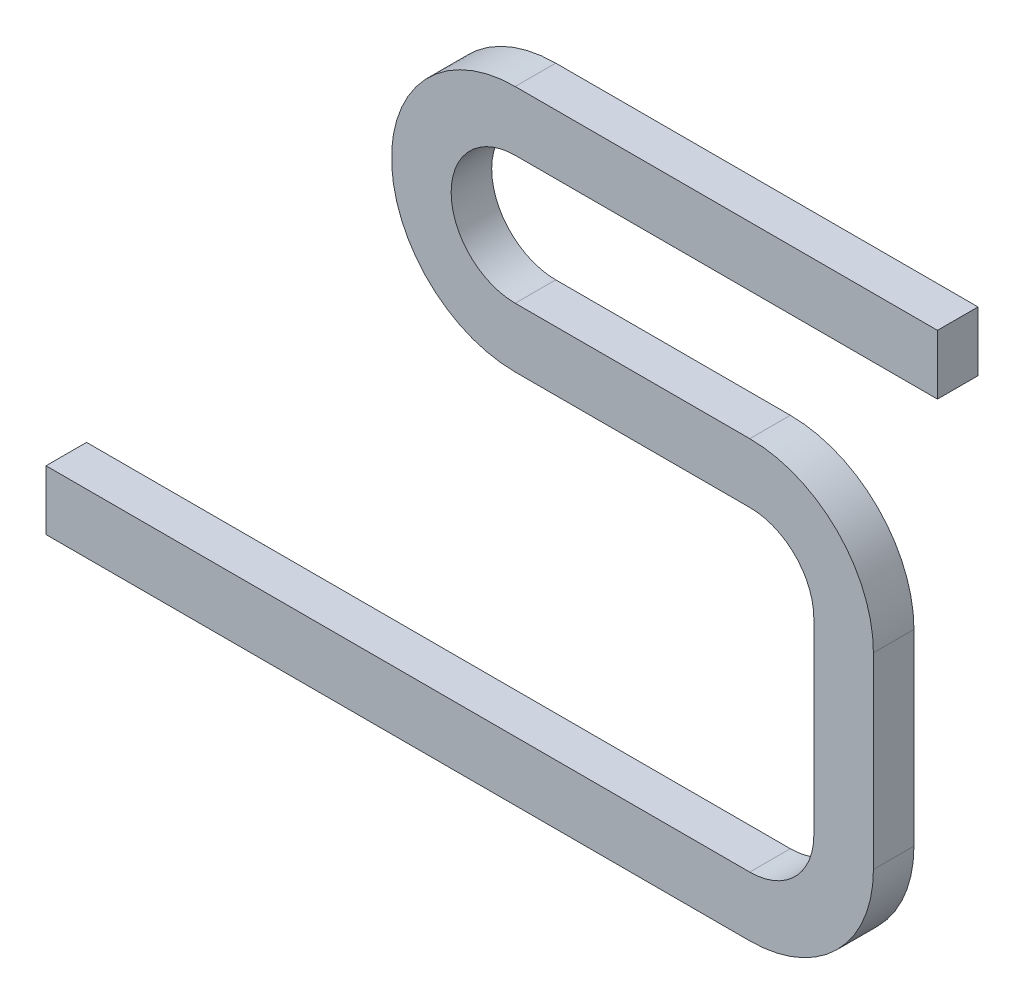
ISO-10303-21;
HEADER;
FILE_DESCRIPTION(('STEP AP214'),'2;1');
FILE_NAME('part.step','',(''),(''),'','','');
FILE_SCHEMA(('AUTOMOTIVE_DESIGN { 1 0 10303 214 1 1 1 1 }'));
ENDSEC;
DATA;
#1=APPLICATION_CONTEXT('core data for automotive mechanical design processes');
#2=APPLICATION_PROTOCOL_DEFINITION('international standard','automotive_design',2000,#1);
#3=PRODUCT_CONTEXT('',#1,'mechanical');
#4=PRODUCT('Part','Part','',(#3));
#5=PRODUCT_RELATED_PRODUCT_CATEGORY('part','',(#4));
#6=PRODUCT_DEFINITION_FORMATION('','',#4);
#7=PRODUCT_DEFINITION_CONTEXT('part definition',#1,'design');
#8=PRODUCT_DEFINITION('design','',#6,#7);
#9=PRODUCT_DEFINITION_SHAPE('','',#8);
#10=(LENGTH_UNIT() NAMED_UNIT(*) SI_UNIT(.MILLI.,.METRE.));
#11=(NAMED_UNIT(*) PLANE_ANGLE_UNIT() SI_UNIT($,.RADIAN.));
#12=(NAMED_UNIT(*) SI_UNIT($,.STERADIAN.) SOLID_ANGLE_UNIT());
#13=UNCERTAINTY_MEASURE_WITH_UNIT(LENGTH_MEASURE(1.E-05),#10,'distance_accuracy_value','');
#14=(GEOMETRIC_REPRESENTATION_CONTEXT(3) GLOBAL_UNCERTAINTY_ASSIGNED_CONTEXT((#13)) GLOBAL_UNIT_ASSIGNED_CONTEXT((#10,
#11,#12)) REPRESENTATION_CONTEXT('',''));
#15=CARTESIAN_POINT('',(0.,0.,0.));
#16=DIRECTION('',(0.,0.,1.));
#17=DIRECTION('',(1.,0.,0.));
#18=AXIS2_PLACEMENT_3D('',#15,#16,#17);
#19=CARTESIAN_POINT('',(5.,5.6825,0.216));
#20=DIRECTION('',(0.,-1.,0.));
#21=DIRECTION('',(0.,0.,-1.));
#22=AXIS2_PLACEMENT_3D('',#19,#20,#21);
#23=PLANE('',#22);
#24=DIRECTION('',(0.,0.,-1.));
#25=VECTOR('',#24,1.);
#26=CARTESIAN_POINT('',(5.,5.6825,0.216));
#27=LINE('',#26,#25);
#28=CARTESIAN_POINT('',(5.,5.6825,0.216));
#29=VERTEX_POINT('',#28);
#30=CARTESIAN_POINT('',(5.,5.6825,-0.216));
#31=VERTEX_POINT('',#30);
#32=EDGE_CURVE('E273',#29,#31,#27,.T.);
#33=ORIENTED_EDGE('',*,*,#32,.T.);
#34=DIRECTION('',(1.,0.,0.));
#35=VECTOR('',#34,1.);
#36=CARTESIAN_POINT('',(5.,5.6825,-0.216));
#37=LINE('',#36,#35);
#38=CARTESIAN_POINT('',(9.5,5.6825,-0.216));
#39=VERTEX_POINT('',#38);
#40=EDGE_CURVE('E54',#31,#39,#37,.T.);
#41=ORIENTED_EDGE('',*,*,#40,.T.);
#42=DIRECTION('',(0.,0.,-1.));
#43=VECTOR('',#42,1.);
#44=CARTESIAN_POINT('',(9.5,5.6825,0.216));
#45=LINE('',#44,#43);
#46=CARTESIAN_POINT('',(9.5,5.6825,0.216));
#47=VERTEX_POINT('',#46);
#48=EDGE_CURVE('E61',#47,#39,#45,.T.);
#49=ORIENTED_EDGE('',*,*,#48,.F.);
#50=DIRECTION('',(1.,0.,0.));
#51=VECTOR('',#50,1.);
#52=CARTESIAN_POINT('',(5.,5.6825,0.216));
#53=LINE('',#52,#51);
#54=EDGE_CURVE('E12',#29,#47,#53,.T.);
#55=ORIENTED_EDGE('',*,*,#54,.F.);
#56=EDGE_LOOP('',(#33,#41,#49,#55));
#57=FACE_BOUND('',#56,.T.);
#58=ADVANCED_FACE('F47',(#57),#23,.T.);
#59=CARTESIAN_POINT('',(5.,6.3175,0.216));
#60=DIRECTION('',(0.,1.,0.));
#61=DIRECTION('',(0.,0.,1.));
#62=AXIS2_PLACEMENT_3D('',#59,#60,#61);
#63=PLANE('',#62);
#64=DIRECTION('',(0.,0.,1.));
#65=VECTOR('',#64,1.);
#66=CARTESIAN_POINT('',(5.,6.3175,0.216));
#67=LINE('',#66,#65);
#68=CARTESIAN_POINT('',(5.,6.3175,-0.216));
#69=VERTEX_POINT('',#68);
#70=CARTESIAN_POINT('',(5.,6.3175,0.216));
#71=VERTEX_POINT('',#70);
#72=EDGE_CURVE('E270',#69,#71,#67,.T.);
#73=ORIENTED_EDGE('',*,*,#72,.T.);
#74=DIRECTION('',(1.,0.,0.));
#75=VECTOR('',#74,1.);
#76=CARTESIAN_POINT('',(5.,6.3175,0.216));
#77=LINE('',#76,#75);
#78=CARTESIAN_POINT('',(9.5,6.3175,0.216));
#79=VERTEX_POINT('',#78);
#80=EDGE_CURVE('E303',#71,#79,#77,.T.);
#81=ORIENTED_EDGE('',*,*,#80,.T.);
#82=DIRECTION('',(0.,0.,1.));
#83=VECTOR('',#82,1.);
#84=CARTESIAN_POINT('',(9.5,6.3175,0.216));
#85=LINE('',#84,#83);
#86=CARTESIAN_POINT('',(9.5,6.3175,-0.216));
#87=VERTEX_POINT('',#86);
#88=EDGE_CURVE('E290',#87,#79,#85,.T.);
#89=ORIENTED_EDGE('',*,*,#88,.F.);
#90=DIRECTION('',(1.,0.,0.));
#91=VECTOR('',#90,1.);
#92=CARTESIAN_POINT('',(5.,6.3175,-0.216));
#93=LINE('',#92,#91);
#94=EDGE_CURVE('E307',#69,#87,#93,.T.);
#95=ORIENTED_EDGE('',*,*,#94,.F.);
#96=EDGE_LOOP('',(#73,#81,#89,#95));
#97=FACE_BOUND('',#96,.T.);
#98=ADVANCED_FACE('F344',(#97),#63,.T.);
#99=CARTESIAN_POINT('',(5.,5.,0.));
#100=DIRECTION('',(0.,0.,-1.));
#101=DIRECTION('',(-1.,0.,0.));
#102=AXIS2_PLACEMENT_3D('',#99,#100,#101);
#103=CYLINDRICAL_SURFACE('',#102,0.682500000000001);
#104=DIRECTION('',(0.,0.,-1.));
#105=VECTOR('',#104,1.);
#106=CARTESIAN_POINT('',(5.,4.3175,0.216));
#107=LINE('',#106,#105);
#108=CARTESIAN_POINT('',(5.,4.3175,0.216));
#109=VERTEX_POINT('',#108);
#110=CARTESIAN_POINT('',(5.,4.3175,-0.216));
#111=VERTEX_POINT('',#110);
#112=EDGE_CURVE('E255',#109,#111,#107,.T.);
#113=ORIENTED_EDGE('',*,*,#112,.T.);
#114=CARTESIAN_POINT('',(5.,5.,-0.216));
#115=DIRECTION('',(0.,0.,-1.));
#116=DIRECTION('',(-1.,0.,0.));
#117=AXIS2_PLACEMENT_3D('',#114,#115,#116);
#118=CIRCLE('',#117,0.682500000000001);
#119=EDGE_CURVE('E282',#111,#31,#118,.T.);
#120=ORIENTED_EDGE('',*,*,#119,.T.);
#121=ORIENTED_EDGE('',*,*,#32,.F.);
#122=CARTESIAN_POINT('',(5.,5.,0.216));
#123=DIRECTION('',(0.,0.,-1.));
#124=DIRECTION('',(-1.,0.,0.));
#125=AXIS2_PLACEMENT_3D('',#122,#123,#124);
#126=CIRCLE('',#125,0.682500000000001);
#127=EDGE_CURVE('E285',#109,#29,#126,.T.);
#128=ORIENTED_EDGE('',*,*,#127,.F.);
#129=EDGE_LOOP('',(#113,#120,#121,#128));
#130=FACE_BOUND('',#129,.T.);
#131=ADVANCED_FACE('F312',(#130),#103,.F.);
#132=CARTESIAN_POINT('',(5.,5.,0.));
#133=DIRECTION('',(0.,0.,-1.));
#134=DIRECTION('',(-1.,0.,0.));
#135=AXIS2_PLACEMENT_3D('',#132,#133,#134);
#136=CYLINDRICAL_SURFACE('',#135,1.3175);
#137=DIRECTION('',(0.,0.,1.));
#138=VECTOR('',#137,1.);
#139=CARTESIAN_POINT('',(5.,3.6825,0.216));
#140=LINE('',#139,#138);
#141=CARTESIAN_POINT('',(5.,3.6825,-0.216));
#142=VERTEX_POINT('',#141);
#143=CARTESIAN_POINT('',(5.,3.6825,0.216));
#144=VERTEX_POINT('',#143);
#145=EDGE_CURVE('E252',#142,#144,#140,.T.);
#146=ORIENTED_EDGE('',*,*,#145,.T.);
#147=CARTESIAN_POINT('',(5.,5.,0.216));
#148=DIRECTION('',(0.,0.,-1.));
#149=DIRECTION('',(-1.,0.,0.));
#150=AXIS2_PLACEMENT_3D('',#147,#148,#149);
#151=CIRCLE('',#150,1.3175);
#152=EDGE_CURVE('E276',#144,#71,#151,.T.);
#153=ORIENTED_EDGE('',*,*,#152,.T.);
#154=ORIENTED_EDGE('',*,*,#72,.F.);
#155=CARTESIAN_POINT('',(5.,5.,-0.216));
#156=DIRECTION('',(0.,0.,-1.));
#157=DIRECTION('',(-1.,0.,0.));
#158=AXIS2_PLACEMENT_3D('',#155,#156,#157);
#159=CIRCLE('',#158,1.3175);
#160=EDGE_CURVE('E279',#142,#69,#159,.T.);
#161=ORIENTED_EDGE('',*,*,#160,.F.);
#162=EDGE_LOOP('',(#146,#153,#154,#161));
#163=FACE_BOUND('',#162,.T.);
#164=ADVANCED_FACE('F342',(#163),#136,.T.);
#165=CARTESIAN_POINT('',(7.5,4.3175,0.216));
#166=DIRECTION('',(0.,1.,0.));
#167=DIRECTION('',(-1.,0.,0.));
#168=AXIS2_PLACEMENT_3D('',#165,#166,#167);
#169=PLANE('',#168);
#170=DIRECTION('',(0.,0.,-1.));
#171=VECTOR('',#170,1.);
#172=CARTESIAN_POINT('',(7.5,4.3175,0.216));
#173=LINE('',#172,#171);
#174=CARTESIAN_POINT('',(7.5,4.3175,0.216));
#175=VERTEX_POINT('',#174);
#176=CARTESIAN_POINT('',(7.5,4.3175,-0.216));
#177=VERTEX_POINT('',#176);
#178=EDGE_CURVE('E237',#175,#177,#173,.T.);
#179=ORIENTED_EDGE('',*,*,#178,.T.);
#180=DIRECTION('',(-1.,0.,0.));
#181=VECTOR('',#180,1.);
#182=CARTESIAN_POINT('',(7.5,4.3175,-0.216));
#183=LINE('',#182,#181);
#184=EDGE_CURVE('E264',#177,#111,#183,.T.);
#185=ORIENTED_EDGE('',*,*,#184,.T.);
#186=ORIENTED_EDGE('',*,*,#112,.F.);
#187=DIRECTION('',(-1.,0.,0.));
#188=VECTOR('',#187,1.);
#189=CARTESIAN_POINT('',(7.5,4.3175,0.216));
#190=LINE('',#189,#188);
#191=EDGE_CURVE('E267',#175,#109,#190,.T.);
#192=ORIENTED_EDGE('',*,*,#191,.F.);
#193=EDGE_LOOP('',(#179,#185,#186,#192));
#194=FACE_BOUND('',#193,.T.);
#195=ADVANCED_FACE('F314',(#194),#169,.T.);
#196=CARTESIAN_POINT('',(7.5,3.6825,0.216));
#197=DIRECTION('',(0.,-1.,0.));
#198=DIRECTION('',(1.,0.,0.));
#199=AXIS2_PLACEMENT_3D('',#196,#197,#198);
#200=PLANE('',#199);
#201=DIRECTION('',(0.,0.,1.));
#202=VECTOR('',#201,1.);
#203=CARTESIAN_POINT('',(7.5,3.6825,0.216));
#204=LINE('',#203,#202);
#205=CARTESIAN_POINT('',(7.5,3.6825,-0.216));
#206=VERTEX_POINT('',#205);
#207=CARTESIAN_POINT('',(7.5,3.6825,0.216));
#208=VERTEX_POINT('',#207);
#209=EDGE_CURVE('E234',#206,#208,#204,.T.);
#210=ORIENTED_EDGE('',*,*,#209,.T.);
#211=DIRECTION('',(-1.,0.,0.));
#212=VECTOR('',#211,1.);
#213=CARTESIAN_POINT('',(7.5,3.6825,0.216));
#214=LINE('',#213,#212);
#215=EDGE_CURVE('E258',#208,#144,#214,.T.);
#216=ORIENTED_EDGE('',*,*,#215,.T.);
#217=ORIENTED_EDGE('',*,*,#145,.F.);
#218=DIRECTION('',(-1.,0.,0.));
#219=VECTOR('',#218,1.);
#220=CARTESIAN_POINT('',(7.5,3.6825,-0.216));
#221=LINE('',#220,#219);
#222=EDGE_CURVE('E261',#206,#142,#221,.T.);
#223=ORIENTED_EDGE('',*,*,#222,.F.);
#224=EDGE_LOOP('',(#210,#216,#217,#223));
#225=FACE_BOUND('',#224,.T.);
#226=ADVANCED_FACE('F338',(#225),#200,.T.);
#227=CARTESIAN_POINT('',(7.5,3.,0.));
#228=DIRECTION('',(0.,0.,1.));
#229=DIRECTION('',(1.,0.,0.));
#230=AXIS2_PLACEMENT_3D('',#227,#228,#229);
#231=CYLINDRICAL_SURFACE('',#230,1.3175);
#232=DIRECTION('',(0.,0.,-1.));
#233=VECTOR('',#232,1.);
#234=CARTESIAN_POINT('',(8.8175,3.,0.216));
#235=LINE('',#234,#233);
#236=CARTESIAN_POINT('',(8.8175,3.,0.216));
#237=VERTEX_POINT('',#236);
#238=CARTESIAN_POINT('',(8.8175,3.,-0.216));
#239=VERTEX_POINT('',#238);
#240=EDGE_CURVE('E219',#237,#239,#235,.T.);
#241=ORIENTED_EDGE('',*,*,#240,.T.);
#242=CARTESIAN_POINT('',(7.5,3.,-0.216));
#243=DIRECTION('',(0.,0.,1.));
#244=DIRECTION('',(1.,0.,0.));
#245=AXIS2_PLACEMENT_3D('',#242,#243,#244);
#246=CIRCLE('',#245,1.3175);
#247=EDGE_CURVE('E246',#239,#177,#246,.T.);
#248=ORIENTED_EDGE('',*,*,#247,.T.);
#249=ORIENTED_EDGE('',*,*,#178,.F.);
#250=CARTESIAN_POINT('',(7.5,3.,0.216));
#251=DIRECTION('',(0.,0.,1.));
#252=DIRECTION('',(1.,0.,0.));
#253=AXIS2_PLACEMENT_3D('',#250,#251,#252);
#254=CIRCLE('',#253,1.3175);
#255=EDGE_CURVE('E249',#237,#175,#254,.T.);
#256=ORIENTED_EDGE('',*,*,#255,.F.);
#257=EDGE_LOOP('',(#241,#248,#249,#256));
#258=FACE_BOUND('',#257,.T.);
#259=ADVANCED_FACE('F317',(#258),#231,.T.);
#260=CARTESIAN_POINT('',(7.5,3.,0.));
#261=DIRECTION('',(0.,0.,1.));
#262=DIRECTION('',(1.,0.,0.));
#263=AXIS2_PLACEMENT_3D('',#260,#261,#262);
#264=CYLINDRICAL_SURFACE('',#263,0.6825);
#265=DIRECTION('',(0.,0.,1.));
#266=VECTOR('',#265,1.);
#267=CARTESIAN_POINT('',(8.1825,3.,0.216));
#268=LINE('',#267,#266);
#269=CARTESIAN_POINT('',(8.1825,3.,-0.216));
#270=VERTEX_POINT('',#269);
#271=CARTESIAN_POINT('',(8.1825,3.,0.216));
#272=VERTEX_POINT('',#271);
#273=EDGE_CURVE('E216',#270,#272,#268,.T.);
#274=ORIENTED_EDGE('',*,*,#273,.T.);
#275=CARTESIAN_POINT('',(7.5,3.,0.216));
#276=DIRECTION('',(0.,0.,1.));
#277=DIRECTION('',(1.,0.,0.));
#278=AXIS2_PLACEMENT_3D('',#275,#276,#277);
#279=CIRCLE('',#278,0.6825);
#280=EDGE_CURVE('E240',#272,#208,#279,.T.);
#281=ORIENTED_EDGE('',*,*,#280,.T.);
#282=ORIENTED_EDGE('',*,*,#209,.F.);
#283=CARTESIAN_POINT('',(7.5,3.,-0.216));
#284=DIRECTION('',(0.,0.,1.));
#285=DIRECTION('',(1.,0.,0.));
#286=AXIS2_PLACEMENT_3D('',#283,#284,#285);
#287=CIRCLE('',#286,0.6825);
#288=EDGE_CURVE('E243',#270,#206,#287,.T.);
#289=ORIENTED_EDGE('',*,*,#288,.F.);
#290=EDGE_LOOP('',(#274,#281,#282,#289));
#291=FACE_BOUND('',#290,.T.);
#292=ADVANCED_FACE('F335',(#291),#264,.F.);
#293=CARTESIAN_POINT('',(8.8175,0.999999999999997,0.216));
#294=DIRECTION('',(1.,0.,0.));
#295=DIRECTION('',(0.,0.,-1.));
#296=AXIS2_PLACEMENT_3D('',#293,#294,#295);
#297=PLANE('',#296);
#298=DIRECTION('',(0.,0.,-1.));
#299=VECTOR('',#298,1.);
#300=CARTESIAN_POINT('',(8.8175,0.999999999999997,0.216));
#301=LINE('',#300,#299);
#302=CARTESIAN_POINT('',(8.8175,0.999999999999997,0.216));
#303=VERTEX_POINT('',#302);
#304=CARTESIAN_POINT('',(8.8175,0.999999999999997,-0.216));
#305=VERTEX_POINT('',#304);
#306=EDGE_CURVE('E202',#303,#305,#301,.T.);
#307=ORIENTED_EDGE('',*,*,#306,.T.);
#308=DIRECTION('',(0.,1.,0.));
#309=VECTOR('',#308,1.);
#310=CARTESIAN_POINT('',(8.8175,0.999999999999997,-0.216));
#311=LINE('',#310,#309);
#312=EDGE_CURVE('E228',#305,#239,#311,.T.);
#313=ORIENTED_EDGE('',*,*,#312,.T.);
#314=ORIENTED_EDGE('',*,*,#240,.F.);
#315=DIRECTION('',(0.,1.,0.));
#316=VECTOR('',#315,1.);
#317=CARTESIAN_POINT('',(8.8175,0.999999999999997,0.216));
#318=LINE('',#317,#316);
#319=EDGE_CURVE('E231',#303,#237,#318,.T.);
#320=ORIENTED_EDGE('',*,*,#319,.F.);
#321=EDGE_LOOP('',(#307,#313,#314,#320));
#322=FACE_BOUND('',#321,.T.);
#323=ADVANCED_FACE('F321',(#322),#297,.T.);
#324=CARTESIAN_POINT('',(8.1825,1.,0.216));
#325=DIRECTION('',(-1.,0.,0.));
#326=DIRECTION('',(0.,0.,1.));
#327=AXIS2_PLACEMENT_3D('',#324,#325,#326);
#328=PLANE('',#327);
#329=DIRECTION('',(0.,0.,1.));
#330=VECTOR('',#329,1.);
#331=CARTESIAN_POINT('',(8.1825,1.,0.216));
#332=LINE('',#331,#330);
#333=CARTESIAN_POINT('',(8.1825,1.,-0.216));
#334=VERTEX_POINT('',#333);
#335=CARTESIAN_POINT('',(8.1825,1.,0.216));
#336=VERTEX_POINT('',#335);
#337=EDGE_CURVE('E179',#334,#336,#332,.T.);
#338=ORIENTED_EDGE('',*,*,#337,.T.);
#339=DIRECTION('',(0.,1.,0.));
#340=VECTOR('',#339,1.);
#341=CARTESIAN_POINT('',(8.1825,1.,0.216));
#342=LINE('',#341,#340);
#343=EDGE_CURVE('E222',#336,#272,#342,.T.);
#344=ORIENTED_EDGE('',*,*,#343,.T.);
#345=ORIENTED_EDGE('',*,*,#273,.F.);
#346=DIRECTION('',(0.,1.,0.));
#347=VECTOR('',#346,1.);
#348=CARTESIAN_POINT('',(8.1825,1.,-0.216));
#349=LINE('',#348,#347);
#350=EDGE_CURVE('E225',#334,#270,#349,.T.);
#351=ORIENTED_EDGE('',*,*,#350,.F.);
#352=EDGE_LOOP('',(#338,#344,#345,#351));
#353=FACE_BOUND('',#352,.T.);
#354=ADVANCED_FACE('F333',(#353),#328,.T.);
#355=CARTESIAN_POINT('',(7.5,1.,0.));
#356=DIRECTION('',(0.,0.,1.));
#357=DIRECTION('',(1.,0.,0.));
#358=AXIS2_PLACEMENT_3D('',#355,#356,#357);
#359=CYLINDRICAL_SURFACE('',#358,1.3175);
#360=DIRECTION('',(0.,0.,-1.));
#361=VECTOR('',#360,1.);
#362=CARTESIAN_POINT('',(7.50000000000001,-0.3175,0.216));
#363=LINE('',#362,#361);
#364=CARTESIAN_POINT('',(7.50000000000001,-0.3175,0.216));
#365=VERTEX_POINT('',#364);
#366=CARTESIAN_POINT('',(7.50000000000001,-0.3175,-0.216));
#367=VERTEX_POINT('',#366);
#368=EDGE_CURVE('E176',#365,#367,#363,.T.);
#369=ORIENTED_EDGE('',*,*,#368,.T.);
#370=CARTESIAN_POINT('',(7.5,1.,-0.216));
#371=DIRECTION('',(0.,0.,1.));
#372=DIRECTION('',(1.,0.,0.));
#373=AXIS2_PLACEMENT_3D('',#370,#371,#372);
#374=CIRCLE('',#373,1.3175);
#375=EDGE_CURVE('E211',#367,#305,#374,.T.);
#376=ORIENTED_EDGE('',*,*,#375,.T.);
#377=ORIENTED_EDGE('',*,*,#306,.F.);
#378=CARTESIAN_POINT('',(7.5,1.,0.216));
#379=DIRECTION('',(0.,0.,1.));
#380=DIRECTION('',(1.,0.,0.));
#381=AXIS2_PLACEMENT_3D('',#378,#379,#380);
#382=CIRCLE('',#381,1.3175);
#383=EDGE_CURVE('E214',#365,#303,#382,.T.);
#384=ORIENTED_EDGE('',*,*,#383,.F.);
#385=EDGE_LOOP('',(#369,#376,#377,#384));
#386=FACE_BOUND('',#385,.T.);
#387=ADVANCED_FACE('F323',(#386),#359,.T.);
#388=CARTESIAN_POINT('',(7.5,1.,0.));
#389=DIRECTION('',(0.,0.,1.));
#390=DIRECTION('',(1.,0.,0.));
#391=AXIS2_PLACEMENT_3D('',#388,#389,#390);
#392=CYLINDRICAL_SURFACE('',#391,0.6825);
#393=DIRECTION('',(0.,0.,1.));
#394=VECTOR('',#393,1.);
#395=CARTESIAN_POINT('',(7.50000000000001,0.3175,0.216));
#396=LINE('',#395,#394);
#397=CARTESIAN_POINT('',(7.50000000000001,0.3175,-0.216));
#398=VERTEX_POINT('',#397);
#399=CARTESIAN_POINT('',(7.50000000000001,0.3175,0.216));
#400=VERTEX_POINT('',#399);
#401=EDGE_CURVE('E192',#398,#400,#396,.T.);
#402=ORIENTED_EDGE('',*,*,#401,.T.);
#403=CARTESIAN_POINT('',(7.5,1.,0.216));
#404=DIRECTION('',(0.,0.,1.));
#405=DIRECTION('',(1.,0.,0.));
#406=AXIS2_PLACEMENT_3D('',#403,#404,#405);
#407=CIRCLE('',#406,0.6825);
#408=EDGE_CURVE('E205',#400,#336,#407,.T.);
#409=ORIENTED_EDGE('',*,*,#408,.T.);
#410=ORIENTED_EDGE('',*,*,#337,.F.);
#411=CARTESIAN_POINT('',(7.5,1.,-0.216));
#412=DIRECTION('',(0.,0.,1.));
#413=DIRECTION('',(1.,0.,0.));
#414=AXIS2_PLACEMENT_3D('',#411,#412,#413);
#415=CIRCLE('',#414,0.6825);
#416=EDGE_CURVE('E208',#398,#334,#415,.T.);
#417=ORIENTED_EDGE('',*,*,#416,.F.);
#418=EDGE_LOOP('',(#402,#409,#410,#417));
#419=FACE_BOUND('',#418,.T.);
#420=ADVANCED_FACE('F329',(#419),#392,.F.);
#421=CARTESIAN_POINT('',(7.50000000000001,-0.3175,0.216));
#422=DIRECTION('',(0.,0.,-1.));
#423=DIRECTION('',(-1.,0.,0.));
#424=AXIS2_PLACEMENT_3D('',#421,#422,#423);
#425=PLANE('',#424);
#426=DIRECTION('',(0.,-1.,0.));
#427=VECTOR('',#426,1.);
#428=CARTESIAN_POINT('',(0.,-0.3175,0.216));
#429=LINE('',#428,#427);
#430=CARTESIAN_POINT('',(0.,0.3175,0.216));
#431=VERTEX_POINT('',#430);
#432=CARTESIAN_POINT('',(0.,-0.3175,0.216));
#433=VERTEX_POINT('',#432);
#434=EDGE_CURVE('E165',#431,#433,#429,.T.);
#435=ORIENTED_EDGE('',*,*,#434,.T.);
#436=DIRECTION('',(-1.,0.,0.));
#437=VECTOR('',#436,1.);
#438=CARTESIAN_POINT('',(7.50000000000001,-0.3175,0.216));
#439=LINE('',#438,#437);
#440=EDGE_CURVE('E173',#365,#433,#439,.T.);
#441=ORIENTED_EDGE('',*,*,#440,.F.);
#442=ORIENTED_EDGE('',*,*,#383,.T.);
#443=ORIENTED_EDGE('',*,*,#319,.T.);
#444=ORIENTED_EDGE('',*,*,#255,.T.);
#445=ORIENTED_EDGE('',*,*,#191,.T.);
#446=ORIENTED_EDGE('',*,*,#127,.T.);
#447=ORIENTED_EDGE('',*,*,#54,.T.);
#448=DIRECTION('',(0.,-1.,0.));
#449=VECTOR('',#448,1.);
#450=CARTESIAN_POINT('',(9.5,5.6825,0.216));
#451=LINE('',#450,#449);
#452=EDGE_CURVE('E288',#79,#47,#451,.T.);
#453=ORIENTED_EDGE('',*,*,#452,.F.);
#454=ORIENTED_EDGE('',*,*,#80,.F.);
#455=ORIENTED_EDGE('',*,*,#152,.F.);
#456=ORIENTED_EDGE('',*,*,#215,.F.);
#457=ORIENTED_EDGE('',*,*,#280,.F.);
#458=ORIENTED_EDGE('',*,*,#343,.F.);
#459=ORIENTED_EDGE('',*,*,#408,.F.);
#460=DIRECTION('',(-1.,0.,0.));
#461=VECTOR('',#460,1.);
#462=CARTESIAN_POINT('',(7.50000000000001,0.3175,0.216));
#463=LINE('',#462,#461);
#464=EDGE_CURVE('E185',#400,#431,#463,.T.);
#465=ORIENTED_EDGE('',*,*,#464,.T.);
#466=EDGE_LOOP('',(#435,#441,#442,#443,#444,#445,#446,#447,#453,#454,#455,#456,#457,#458,#459,#465));
#467=FACE_BOUND('',#466,.T.);
#468=ADVANCED_FACE('F183',(#467),#425,.F.);
#469=CARTESIAN_POINT('',(7.50000000000001,-0.3175,0.216));
#470=DIRECTION('',(0.,1.,0.));
#471=DIRECTION('',(0.,0.,1.));
#472=AXIS2_PLACEMENT_3D('',#469,#470,#471);
#473=PLANE('',#472);
#474=DIRECTION('',(0.,0.,-1.));
#475=VECTOR('',#474,1.);
#476=CARTESIAN_POINT('',(0.,-0.3175,0.216));
#477=LINE('',#476,#475);
#478=CARTESIAN_POINT('',(0.,-0.3175,-0.216));
#479=VERTEX_POINT('',#478);
#480=EDGE_CURVE('E160',#433,#479,#477,.T.);
#481=ORIENTED_EDGE('',*,*,#480,.T.);
#482=DIRECTION('',(-1.,0.,0.));
#483=VECTOR('',#482,1.);
#484=CARTESIAN_POINT('',(7.50000000000001,-0.3175,-0.216));
#485=LINE('',#484,#483);
#486=EDGE_CURVE('E180',#367,#479,#485,.T.);
#487=ORIENTED_EDGE('',*,*,#486,.F.);
#488=ORIENTED_EDGE('',*,*,#368,.F.);
#489=ORIENTED_EDGE('',*,*,#440,.T.);
#490=EDGE_LOOP('',(#481,#487,#488,#489));
#491=FACE_BOUND('',#490,.T.);
#492=ADVANCED_FACE('F174',(#491),#473,.F.);
#493=CARTESIAN_POINT('',(7.50000000000001,-0.3175,-0.216));
#494=DIRECTION('',(0.,0.,1.));
#495=DIRECTION('',(1.,0.,0.));
#496=AXIS2_PLACEMENT_3D('',#493,#494,#495);
#497=PLANE('',#496);
#498=DIRECTION('',(0.,1.,0.));
#499=VECTOR('',#498,1.);
#500=CARTESIAN_POINT('',(0.,-0.3175,-0.216));
#501=LINE('',#500,#499);
#502=CARTESIAN_POINT('',(0.,0.3175,-0.216));
#503=VERTEX_POINT('',#502);
#504=EDGE_CURVE('E166',#479,#503,#501,.T.);
#505=ORIENTED_EDGE('',*,*,#504,.T.);
#506=DIRECTION('',(-1.,0.,0.));
#507=VECTOR('',#506,1.);
#508=CARTESIAN_POINT('',(7.50000000000001,0.3175,-0.216));
#509=LINE('',#508,#507);
#510=EDGE_CURVE('E196',#398,#503,#509,.T.);
#511=ORIENTED_EDGE('',*,*,#510,.F.);
#512=ORIENTED_EDGE('',*,*,#416,.T.);
#513=ORIENTED_EDGE('',*,*,#350,.T.);
#514=ORIENTED_EDGE('',*,*,#288,.T.);
#515=ORIENTED_EDGE('',*,*,#222,.T.);
#516=ORIENTED_EDGE('',*,*,#160,.T.);
#517=ORIENTED_EDGE('',*,*,#94,.T.);
#518=DIRECTION('',(0.,1.,0.));
#519=VECTOR('',#518,1.);
#520=CARTESIAN_POINT('',(9.5,5.6825,-0.216));
#521=LINE('',#520,#519);
#522=EDGE_CURVE('E69',#39,#87,#521,.T.);
#523=ORIENTED_EDGE('',*,*,#522,.F.);
#524=ORIENTED_EDGE('',*,*,#40,.F.);
#525=ORIENTED_EDGE('',*,*,#119,.F.);
#526=ORIENTED_EDGE('',*,*,#184,.F.);
#527=ORIENTED_EDGE('',*,*,#247,.F.);
#528=ORIENTED_EDGE('',*,*,#312,.F.);
#529=ORIENTED_EDGE('',*,*,#375,.F.);
#530=ORIENTED_EDGE('',*,*,#486,.T.);
#531=EDGE_LOOP('',(#505,#511,#512,#513,#514,#515,#516,#517,#523,#524,#525,#526,#527,#528,#529,#530));
#532=FACE_BOUND('',#531,.T.);
#533=ADVANCED_FACE('F309',(#532),#497,.F.);
#534=CARTESIAN_POINT('',(7.50000000000001,0.3175,0.216));
#535=DIRECTION('',(0.,-1.,0.));
#536=DIRECTION('',(0.,0.,-1.));
#537=AXIS2_PLACEMENT_3D('',#534,#535,#536);
#538=PLANE('',#537);
#539=DIRECTION('',(0.,0.,1.));
#540=VECTOR('',#539,1.);
#541=CARTESIAN_POINT('',(0.,0.3175,0.216));
#542=LINE('',#541,#540);
#543=EDGE_CURVE('E189',#503,#431,#542,.T.);
#544=ORIENTED_EDGE('',*,*,#543,.T.);
#545=ORIENTED_EDGE('',*,*,#464,.F.);
#546=ORIENTED_EDGE('',*,*,#401,.F.);
#547=ORIENTED_EDGE('',*,*,#510,.T.);
#548=EDGE_LOOP('',(#544,#545,#546,#547));
#549=FACE_BOUND('',#548,.T.);
#550=ADVANCED_FACE('F327',(#549),#538,.F.);
#551=CARTESIAN_POINT('',(9.5,6.3175,0.216));
#552=DIRECTION('',(-1.,0.,0.));
#553=DIRECTION('',(0.,0.,1.));
#554=AXIS2_PLACEMENT_3D('',#551,#552,#553);
#555=PLANE('',#554);
#556=ORIENTED_EDGE('',*,*,#452,.T.);
#557=ORIENTED_EDGE('',*,*,#48,.T.);
#558=ORIENTED_EDGE('',*,*,#522,.T.);
#559=ORIENTED_EDGE('',*,*,#88,.T.);
#560=EDGE_LOOP('',(#556,#557,#558,#559));
#561=FACE_BOUND('',#560,.T.);
#562=ADVANCED_FACE('F346',(#561),#555,.F.);
#563=CARTESIAN_POINT('',(0.,0.3175,0.216));
#564=DIRECTION('',(-1.,0.,0.));
#565=DIRECTION('',(0.,0.,1.));
#566=AXIS2_PLACEMENT_3D('',#563,#564,#565);
#567=PLANE('',#566);
#568=ORIENTED_EDGE('',*,*,#434,.F.);
#569=ORIENTED_EDGE('',*,*,#543,.F.);
#570=ORIENTED_EDGE('',*,*,#504,.F.);
#571=ORIENTED_EDGE('',*,*,#480,.F.);
#572=EDGE_LOOP('',(#568,#569,#570,#571));
#573=FACE_BOUND('',#572,.T.);
#574=ADVANCED_FACE('F162',(#573),#567,.T.);
#575=CLOSED_SHELL('',(#58,#98,#131,#164,#195,#226,#259,#292,#323,#354,#387,#420,#468,#492,#533,
#550,#562,#574));
#576=MANIFOLD_SOLID_BREP('B2',#575);
#577=ADVANCED_BREP_SHAPE_REPRESENTATION('',(#18,#576),#14);
#578=SHAPE_DEFINITION_REPRESENTATION(#9,#577);
ENDSEC;
END-ISO-10303-21;
